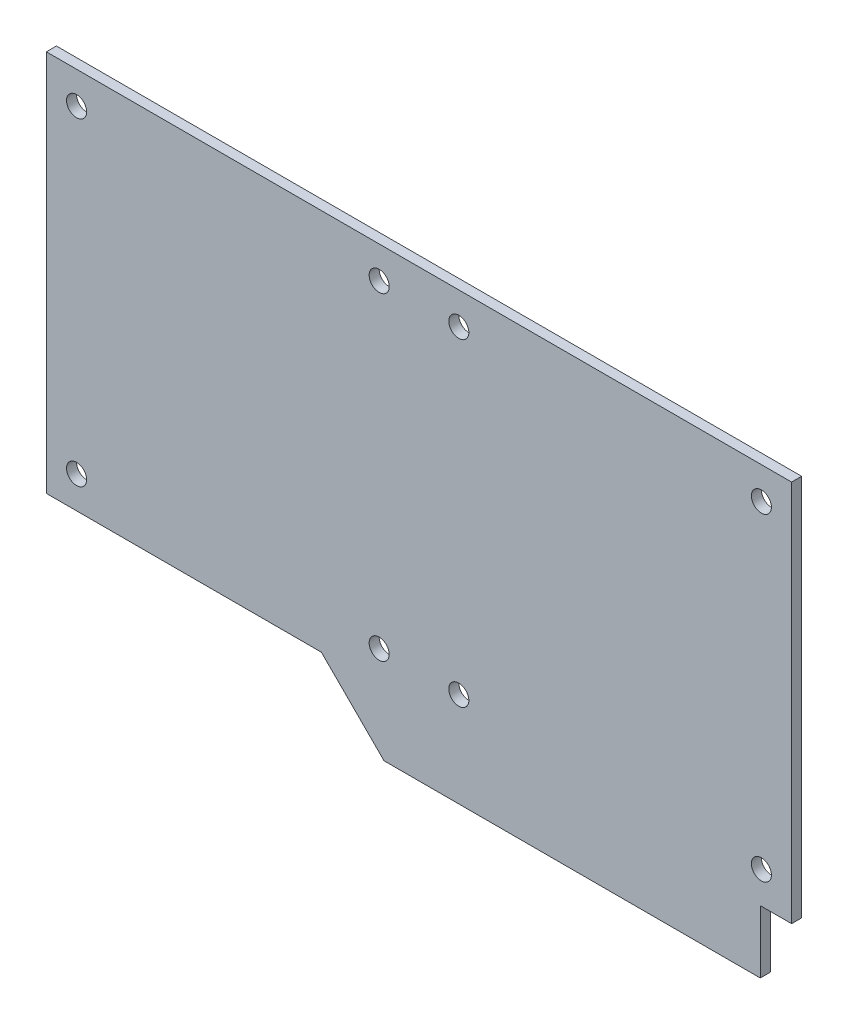
ISO-10303-21;
HEADER;
FILE_DESCRIPTION(('STEP AP214'),'2;1');
FILE_NAME('part.step','',(''),(''),'','','');
FILE_SCHEMA(('AUTOMOTIVE_DESIGN { 1 0 10303 214 1 1 1 1 }'));
ENDSEC;
DATA;
#1=APPLICATION_CONTEXT('core data for automotive mechanical design processes');
#2=APPLICATION_PROTOCOL_DEFINITION('international standard','automotive_design',2000,#1);
#3=PRODUCT_CONTEXT('',#1,'mechanical');
#4=PRODUCT('Part','Part','',(#3));
#5=PRODUCT_RELATED_PRODUCT_CATEGORY('part','',(#4));
#6=PRODUCT_DEFINITION_FORMATION('','',#4);
#7=PRODUCT_DEFINITION_CONTEXT('part definition',#1,'design');
#8=PRODUCT_DEFINITION('design','',#6,#7);
#9=PRODUCT_DEFINITION_SHAPE('','',#8);
#10=(LENGTH_UNIT() NAMED_UNIT(*) SI_UNIT(.MILLI.,.METRE.));
#11=(NAMED_UNIT(*) PLANE_ANGLE_UNIT() SI_UNIT($,.RADIAN.));
#12=(NAMED_UNIT(*) SI_UNIT($,.STERADIAN.) SOLID_ANGLE_UNIT());
#13=UNCERTAINTY_MEASURE_WITH_UNIT(LENGTH_MEASURE(1.E-05),#10,'distance_accuracy_value','');
#14=(GEOMETRIC_REPRESENTATION_CONTEXT(3) GLOBAL_UNCERTAINTY_ASSIGNED_CONTEXT((#13)) GLOBAL_UNIT_ASSIGNED_CONTEXT((#10,
#11,#12)) REPRESENTATION_CONTEXT('',''));
#15=CARTESIAN_POINT('',(0.,0.,0.));
#16=DIRECTION('',(0.,0.,1.));
#17=DIRECTION('',(1.,0.,0.));
#18=AXIS2_PLACEMENT_3D('',#15,#16,#17);
#19=CARTESIAN_POINT('',(59.43,30.5,0.));
#20=DIRECTION('',(0.,0.,1.));
#21=DIRECTION('',(1.,0.,0.));
#22=AXIS2_PLACEMENT_3D('',#19,#20,#21);
#23=PLANE('',#22);
#24=CARTESIAN_POINT('',(4.82,5.1,0.));
#25=DIRECTION('',(0.,0.,1.));
#26=DIRECTION('',(1.,0.,0.));
#27=AXIS2_PLACEMENT_3D('',#24,#25,#26);
#28=CIRCLE('',#27,1.6);
#29=CARTESIAN_POINT('',(6.42,5.1,0.));
#30=VERTEX_POINT('',#29);
#31=EDGE_CURVE('E138',#30,#30,#28,.T.);
#32=ORIENTED_EDGE('',*,*,#31,.T.);
#33=EDGE_LOOP('',(#32));
#34=FACE_BOUND('',#33,.T.);
#35=CARTESIAN_POINT('',(4.81999999999999,55.9,0.));
#36=DIRECTION('',(0.,0.,1.));
#37=DIRECTION('',(1.,0.,0.));
#38=AXIS2_PLACEMENT_3D('',#35,#36,#37);
#39=CIRCLE('',#38,1.6);
#40=CARTESIAN_POINT('',(6.41999999999999,55.9,0.));
#41=VERTEX_POINT('',#40);
#42=EDGE_CURVE('E142',#41,#41,#39,.T.);
#43=ORIENTED_EDGE('',*,*,#42,.T.);
#44=EDGE_LOOP('',(#43));
#45=FACE_BOUND('',#44,.T.);
#46=CARTESIAN_POINT('',(53.08,5.1,0.));
#47=DIRECTION('',(0.,0.,1.));
#48=DIRECTION('',(1.,0.,0.));
#49=AXIS2_PLACEMENT_3D('',#46,#47,#48);
#50=CIRCLE('',#49,1.6);
#51=CARTESIAN_POINT('',(54.68,5.1,0.));
#52=VERTEX_POINT('',#51);
#53=EDGE_CURVE('E146',#52,#52,#50,.T.);
#54=ORIENTED_EDGE('',*,*,#53,.T.);
#55=EDGE_LOOP('',(#54));
#56=FACE_BOUND('',#55,.T.);
#57=CARTESIAN_POINT('',(53.08,55.9,0.));
#58=DIRECTION('',(0.,0.,1.));
#59=DIRECTION('',(1.,0.,0.));
#60=AXIS2_PLACEMENT_3D('',#57,#58,#59);
#61=CIRCLE('',#60,1.6);
#62=CARTESIAN_POINT('',(54.68,55.9,0.));
#63=VERTEX_POINT('',#62);
#64=EDGE_CURVE('E149',#63,#63,#61,.T.);
#65=ORIENTED_EDGE('',*,*,#64,.T.);
#66=EDGE_LOOP('',(#65));
#67=FACE_BOUND('',#66,.T.);
#68=CARTESIAN_POINT('',(114.04,5.1,0.));
#69=DIRECTION('',(0.,0.,1.));
#70=DIRECTION('',(1.,0.,0.));
#71=AXIS2_PLACEMENT_3D('',#68,#69,#70);
#72=CIRCLE('',#71,1.6);
#73=CARTESIAN_POINT('',(115.64,5.1,0.));
#74=VERTEX_POINT('',#73);
#75=EDGE_CURVE('E152',#74,#74,#72,.T.);
#76=ORIENTED_EDGE('',*,*,#75,.T.);
#77=EDGE_LOOP('',(#76));
#78=FACE_BOUND('',#77,.T.);
#79=CARTESIAN_POINT('',(65.78,5.1,0.));
#80=DIRECTION('',(0.,0.,1.));
#81=DIRECTION('',(1.,0.,0.));
#82=AXIS2_PLACEMENT_3D('',#79,#80,#81);
#83=CIRCLE('',#82,1.6);
#84=CARTESIAN_POINT('',(67.38,5.1,0.));
#85=VERTEX_POINT('',#84);
#86=EDGE_CURVE('E155',#85,#85,#83,.T.);
#87=ORIENTED_EDGE('',*,*,#86,.T.);
#88=EDGE_LOOP('',(#87));
#89=FACE_BOUND('',#88,.T.);
#90=CARTESIAN_POINT('',(114.04,55.9,0.));
#91=DIRECTION('',(0.,0.,1.));
#92=DIRECTION('',(1.,0.,0.));
#93=AXIS2_PLACEMENT_3D('',#90,#91,#92);
#94=CIRCLE('',#93,1.6);
#95=CARTESIAN_POINT('',(115.64,55.9,0.));
#96=VERTEX_POINT('',#95);
#97=EDGE_CURVE('E157',#96,#96,#94,.T.);
#98=ORIENTED_EDGE('',*,*,#97,.T.);
#99=EDGE_LOOP('',(#98));
#100=FACE_BOUND('',#99,.T.);
#101=CARTESIAN_POINT('',(65.78,55.9,0.));
#102=DIRECTION('',(0.,0.,1.));
#103=DIRECTION('',(1.,0.,0.));
#104=AXIS2_PLACEMENT_3D('',#101,#102,#103);
#105=CIRCLE('',#104,1.6);
#106=CARTESIAN_POINT('',(67.38,55.9,0.));
#107=VERTEX_POINT('',#106);
#108=EDGE_CURVE('E20',#107,#107,#105,.T.);
#109=ORIENTED_EDGE('',*,*,#108,.T.);
#110=EDGE_LOOP('',(#109));
#111=FACE_BOUND('',#110,.T.);
#112=DIRECTION('',(0.,1.,0.));
#113=VECTOR('',#112,1.);
#114=CARTESIAN_POINT('',(0.,0.,0.));
#115=LINE('',#114,#113);
#116=CARTESIAN_POINT('',(0.,61.,0.));
#117=VERTEX_POINT('',#116);
#118=CARTESIAN_POINT('',(0.,0.,0.));
#119=VERTEX_POINT('',#118);
#120=EDGE_CURVE('E90',#117,#119,#115,.F.);
#121=ORIENTED_EDGE('',*,*,#120,.F.);
#122=DIRECTION('',(1.,0.,0.));
#123=VECTOR('',#122,1.);
#124=CARTESIAN_POINT('',(0.,61.,0.));
#125=LINE('',#124,#123);
#126=CARTESIAN_POINT('',(118.86,61.,0.));
#127=VERTEX_POINT('',#126);
#128=EDGE_CURVE('E165',#127,#117,#125,.F.);
#129=ORIENTED_EDGE('',*,*,#128,.F.);
#130=DIRECTION('',(0.,1.,0.));
#131=VECTOR('',#130,1.);
#132=CARTESIAN_POINT('',(118.86,61.,0.));
#133=LINE('',#132,#131);
#134=CARTESIAN_POINT('',(118.86,0.,0.));
#135=VERTEX_POINT('',#134);
#136=EDGE_CURVE('E176',#135,#127,#133,.T.);
#137=ORIENTED_EDGE('',*,*,#136,.F.);
#138=DIRECTION('',(1.,0.,0.));
#139=VECTOR('',#138,1.);
#140=CARTESIAN_POINT('',(118.86,0.,0.));
#141=LINE('',#140,#139);
#142=CARTESIAN_POINT('',(113.86,0.,0.));
#143=VERTEX_POINT('',#142);
#144=EDGE_CURVE('E181',#143,#135,#141,.T.);
#145=ORIENTED_EDGE('',*,*,#144,.F.);
#146=DIRECTION('',(0.,1.,0.));
#147=VECTOR('',#146,1.);
#148=CARTESIAN_POINT('',(113.86,-9.99999999999999,0.));
#149=LINE('',#148,#147);
#150=CARTESIAN_POINT('',(113.86,-9.99999999999999,0.));
#151=VERTEX_POINT('',#150);
#152=EDGE_CURVE('E189',#151,#143,#149,.T.);
#153=ORIENTED_EDGE('',*,*,#152,.F.);
#154=DIRECTION('',(1.,0.,0.));
#155=VECTOR('',#154,1.);
#156=CARTESIAN_POINT('',(53.86,-9.99999999999999,0.));
#157=LINE('',#156,#155);
#158=CARTESIAN_POINT('',(53.86,-9.99999999999999,0.));
#159=VERTEX_POINT('',#158);
#160=EDGE_CURVE('E194',#159,#151,#157,.T.);
#161=ORIENTED_EDGE('',*,*,#160,.F.);
#162=DIRECTION('',(0.707106781186548,-0.707106781186548,0.));
#163=VECTOR('',#162,1.);
#164=CARTESIAN_POINT('',(43.86,0.,0.));
#165=LINE('',#164,#163);
#166=CARTESIAN_POINT('',(43.86,0.,0.));
#167=VERTEX_POINT('',#166);
#168=EDGE_CURVE('E83',#167,#159,#165,.T.);
#169=ORIENTED_EDGE('',*,*,#168,.F.);
#170=DIRECTION('',(1.,0.,0.));
#171=VECTOR('',#170,1.);
#172=CARTESIAN_POINT('',(118.86,0.,0.));
#173=LINE('',#172,#171);
#174=EDGE_CURVE('E101',#119,#167,#173,.T.);
#175=ORIENTED_EDGE('',*,*,#174,.F.);
#176=EDGE_LOOP('',(#121,#129,#137,#145,#153,#161,#169,#175));
#177=FACE_BOUND('',#176,.T.);
#178=ADVANCED_FACE('F17',(#34,#45,#56,#67,#78,#89,#100,#111,#177),#23,.F.);
#179=CARTESIAN_POINT('',(0.,0.,0.));
#180=DIRECTION('',(-1.,0.,0.));
#181=DIRECTION('',(0.,0.,1.));
#182=AXIS2_PLACEMENT_3D('',#179,#180,#181);
#183=PLANE('',#182);
#184=ORIENTED_EDGE('',*,*,#120,.T.);
#185=DIRECTION('',(0.,0.,-1.));
#186=VECTOR('',#185,1.);
#187=CARTESIAN_POINT('',(0.,0.,0.));
#188=LINE('',#187,#186);
#189=CARTESIAN_POINT('',(0.,0.,1.6));
#190=VERTEX_POINT('',#189);
#191=EDGE_CURVE('E93',#190,#119,#188,.T.);
#192=ORIENTED_EDGE('',*,*,#191,.F.);
#193=DIRECTION('',(0.,1.,0.));
#194=VECTOR('',#193,1.);
#195=CARTESIAN_POINT('',(0.,30.5,1.6));
#196=LINE('',#195,#194);
#197=CARTESIAN_POINT('',(0.,61.,1.6));
#198=VERTEX_POINT('',#197);
#199=EDGE_CURVE('E141',#198,#190,#196,.F.);
#200=ORIENTED_EDGE('',*,*,#199,.F.);
#201=DIRECTION('',(0.,0.,1.));
#202=VECTOR('',#201,1.);
#203=CARTESIAN_POINT('',(0.,61.,0.));
#204=LINE('',#203,#202);
#205=EDGE_CURVE('E96',#117,#198,#204,.T.);
#206=ORIENTED_EDGE('',*,*,#205,.F.);
#207=EDGE_LOOP('',(#184,#192,#200,#206));
#208=FACE_BOUND('',#207,.T.);
#209=ADVANCED_FACE('F91',(#208),#183,.T.);
#210=CARTESIAN_POINT('',(118.86,0.,0.));
#211=DIRECTION('',(0.,-1.,0.));
#212=DIRECTION('',(0.,0.,-1.));
#213=AXIS2_PLACEMENT_3D('',#210,#211,#212);
#214=PLANE('',#213);
#215=ORIENTED_EDGE('',*,*,#191,.T.);
#216=ORIENTED_EDGE('',*,*,#174,.T.);
#217=DIRECTION('',(0.,0.,1.));
#218=VECTOR('',#217,1.);
#219=CARTESIAN_POINT('',(43.86,0.,1.6));
#220=LINE('',#219,#218);
#221=CARTESIAN_POINT('',(43.86,0.,1.6));
#222=VERTEX_POINT('',#221);
#223=EDGE_CURVE('E197',#222,#167,#220,.F.);
#224=ORIENTED_EDGE('',*,*,#223,.F.);
#225=DIRECTION('',(1.,0.,0.));
#226=VECTOR('',#225,1.);
#227=CARTESIAN_POINT('',(59.43,0.,1.6));
#228=LINE('',#227,#226);
#229=EDGE_CURVE('E108',#190,#222,#228,.T.);
#230=ORIENTED_EDGE('',*,*,#229,.F.);
#231=EDGE_LOOP('',(#215,#216,#224,#230));
#232=FACE_BOUND('',#231,.T.);
#233=ADVANCED_FACE('F106',(#232),#214,.T.);
#234=CARTESIAN_POINT('',(43.86,0.,1.6));
#235=DIRECTION('',(-0.707106781186548,-0.707106781186548,0.));
#236=DIRECTION('',(0.707106781186548,-0.707106781186548,0.));
#237=AXIS2_PLACEMENT_3D('',#234,#235,#236);
#238=PLANE('',#237);
#239=DIRECTION('',(0.707106781186547,-0.707106781186548,0.));
#240=VECTOR('',#239,1.);
#241=CARTESIAN_POINT('',(43.86,0.,1.6));
#242=LINE('',#241,#240);
#243=CARTESIAN_POINT('',(53.86,-9.99999999999999,1.6));
#244=VERTEX_POINT('',#243);
#245=EDGE_CURVE('E211',#222,#244,#242,.T.);
#246=ORIENTED_EDGE('',*,*,#245,.F.);
#247=ORIENTED_EDGE('',*,*,#223,.T.);
#248=ORIENTED_EDGE('',*,*,#168,.T.);
#249=DIRECTION('',(0.,0.,-1.));
#250=VECTOR('',#249,1.);
#251=CARTESIAN_POINT('',(53.86,-9.99999999999999,1.6));
#252=LINE('',#251,#250);
#253=EDGE_CURVE('E191',#244,#159,#252,.T.);
#254=ORIENTED_EDGE('',*,*,#253,.F.);
#255=EDGE_LOOP('',(#246,#247,#248,#254));
#256=FACE_BOUND('',#255,.T.);
#257=ADVANCED_FACE('F200',(#256),#238,.T.);
#258=CARTESIAN_POINT('',(53.86,-9.99999999999999,1.6));
#259=DIRECTION('',(0.,-1.,0.));
#260=DIRECTION('',(0.,0.,-1.));
#261=AXIS2_PLACEMENT_3D('',#258,#259,#260);
#262=PLANE('',#261);
#263=DIRECTION('',(1.,0.,0.));
#264=VECTOR('',#263,1.);
#265=CARTESIAN_POINT('',(59.43,-9.99999999999999,1.6));
#266=LINE('',#265,#264);
#267=CARTESIAN_POINT('',(113.86,-9.99999999999999,1.6));
#268=VERTEX_POINT('',#267);
#269=EDGE_CURVE('E205',#244,#268,#266,.T.);
#270=ORIENTED_EDGE('',*,*,#269,.F.);
#271=ORIENTED_EDGE('',*,*,#253,.T.);
#272=ORIENTED_EDGE('',*,*,#160,.T.);
#273=DIRECTION('',(0.,0.,-1.));
#274=VECTOR('',#273,1.);
#275=CARTESIAN_POINT('',(113.86,-9.99999999999999,1.6));
#276=LINE('',#275,#274);
#277=EDGE_CURVE('E186',#268,#151,#276,.T.);
#278=ORIENTED_EDGE('',*,*,#277,.F.);
#279=EDGE_LOOP('',(#270,#271,#272,#278));
#280=FACE_BOUND('',#279,.T.);
#281=ADVANCED_FACE('F203',(#280),#262,.T.);
#282=CARTESIAN_POINT('',(113.86,-9.99999999999999,1.6));
#283=DIRECTION('',(1.,0.,0.));
#284=DIRECTION('',(0.,0.,-1.));
#285=AXIS2_PLACEMENT_3D('',#282,#283,#284);
#286=PLANE('',#285);
#287=DIRECTION('',(0.,1.,0.));
#288=VECTOR('',#287,1.);
#289=CARTESIAN_POINT('',(113.86,30.5,1.6));
#290=LINE('',#289,#288);
#291=CARTESIAN_POINT('',(113.86,0.,1.6));
#292=VERTEX_POINT('',#291);
#293=EDGE_CURVE('E210',#268,#292,#290,.T.);
#294=ORIENTED_EDGE('',*,*,#293,.F.);
#295=ORIENTED_EDGE('',*,*,#277,.T.);
#296=ORIENTED_EDGE('',*,*,#152,.T.);
#297=DIRECTION('',(0.,0.,-1.));
#298=VECTOR('',#297,1.);
#299=CARTESIAN_POINT('',(113.86,0.,0.));
#300=LINE('',#299,#298);
#301=EDGE_CURVE('E183',#292,#143,#300,.T.);
#302=ORIENTED_EDGE('',*,*,#301,.F.);
#303=EDGE_LOOP('',(#294,#295,#296,#302));
#304=FACE_BOUND('',#303,.T.);
#305=ADVANCED_FACE('F232',(#304),#286,.T.);
#306=CARTESIAN_POINT('',(118.86,0.,0.));
#307=DIRECTION('',(0.,-1.,0.));
#308=DIRECTION('',(0.,0.,-1.));
#309=AXIS2_PLACEMENT_3D('',#306,#307,#308);
#310=PLANE('',#309);
#311=DIRECTION('',(0.,0.,-1.));
#312=VECTOR('',#311,1.);
#313=CARTESIAN_POINT('',(118.86,0.,0.));
#314=LINE('',#313,#312);
#315=CARTESIAN_POINT('',(118.86,0.,1.6));
#316=VERTEX_POINT('',#315);
#317=EDGE_CURVE('E178',#316,#135,#314,.T.);
#318=ORIENTED_EDGE('',*,*,#317,.F.);
#319=DIRECTION('',(1.,0.,0.));
#320=VECTOR('',#319,1.);
#321=CARTESIAN_POINT('',(59.43,0.,1.6));
#322=LINE('',#321,#320);
#323=EDGE_CURVE('E219',#292,#316,#322,.T.);
#324=ORIENTED_EDGE('',*,*,#323,.F.);
#325=ORIENTED_EDGE('',*,*,#301,.T.);
#326=ORIENTED_EDGE('',*,*,#144,.T.);
#327=EDGE_LOOP('',(#318,#324,#325,#326));
#328=FACE_BOUND('',#327,.T.);
#329=ADVANCED_FACE('F230',(#328),#310,.T.);
#330=CARTESIAN_POINT('',(118.86,61.,0.));
#331=DIRECTION('',(1.,0.,0.));
#332=DIRECTION('',(0.,0.,-1.));
#333=AXIS2_PLACEMENT_3D('',#330,#331,#332);
#334=PLANE('',#333);
#335=ORIENTED_EDGE('',*,*,#136,.T.);
#336=DIRECTION('',(0.,0.,1.));
#337=VECTOR('',#336,1.);
#338=CARTESIAN_POINT('',(118.86,61.,0.));
#339=LINE('',#338,#337);
#340=CARTESIAN_POINT('',(118.86,61.,1.6));
#341=VERTEX_POINT('',#340);
#342=EDGE_CURVE('E36',#341,#127,#339,.F.);
#343=ORIENTED_EDGE('',*,*,#342,.F.);
#344=DIRECTION('',(0.,1.,0.));
#345=VECTOR('',#344,1.);
#346=CARTESIAN_POINT('',(118.86,30.5,1.6));
#347=LINE('',#346,#345);
#348=EDGE_CURVE('E222',#316,#341,#347,.T.);
#349=ORIENTED_EDGE('',*,*,#348,.F.);
#350=ORIENTED_EDGE('',*,*,#317,.T.);
#351=EDGE_LOOP('',(#335,#343,#349,#350));
#352=FACE_BOUND('',#351,.T.);
#353=ADVANCED_FACE('F227',(#352),#334,.T.);
#354=CARTESIAN_POINT('',(0.,61.,0.));
#355=DIRECTION('',(0.,1.,0.));
#356=DIRECTION('',(0.,0.,1.));
#357=AXIS2_PLACEMENT_3D('',#354,#355,#356);
#358=PLANE('',#357);
#359=ORIENTED_EDGE('',*,*,#128,.T.);
#360=ORIENTED_EDGE('',*,*,#205,.T.);
#361=DIRECTION('',(1.,0.,0.));
#362=VECTOR('',#361,1.);
#363=CARTESIAN_POINT('',(59.43,61.,1.6));
#364=LINE('',#363,#362);
#365=EDGE_CURVE('E137',#341,#198,#364,.F.);
#366=ORIENTED_EDGE('',*,*,#365,.F.);
#367=ORIENTED_EDGE('',*,*,#342,.T.);
#368=EDGE_LOOP('',(#359,#360,#366,#367));
#369=FACE_BOUND('',#368,.T.);
#370=ADVANCED_FACE('F224',(#369),#358,.T.);
#371=CARTESIAN_POINT('',(65.78,55.9,-132.008606010242));
#372=DIRECTION('',(0.,0.,1.));
#373=DIRECTION('',(1.,0.,0.));
#374=AXIS2_PLACEMENT_3D('',#371,#372,#373);
#375=CYLINDRICAL_SURFACE('',#374,1.6);
#376=CARTESIAN_POINT('',(65.78,55.9,1.59999999999999));
#377=DIRECTION('',(0.,0.,1.));
#378=DIRECTION('',(1.,0.,0.));
#379=AXIS2_PLACEMENT_3D('',#376,#377,#378);
#380=CIRCLE('',#379,1.6);
#381=CARTESIAN_POINT('',(67.38,55.9,1.59999999999999));
#382=VERTEX_POINT('',#381);
#383=EDGE_CURVE('E134',#382,#382,#380,.F.);
#384=ORIENTED_EDGE('',*,*,#383,.F.);
#385=EDGE_LOOP('',(#384));
#386=FACE_BOUND('',#385,.T.);
#387=ORIENTED_EDGE('',*,*,#108,.F.);
#388=EDGE_LOOP('',(#387));
#389=FACE_BOUND('',#388,.T.);
#390=ADVANCED_FACE('F276',(#386,#389),#375,.F.);
#391=CARTESIAN_POINT('',(114.04,55.9,-132.008606010242));
#392=DIRECTION('',(0.,0.,1.));
#393=DIRECTION('',(1.,0.,0.));
#394=AXIS2_PLACEMENT_3D('',#391,#392,#393);
#395=CYLINDRICAL_SURFACE('',#394,1.6);
#396=CARTESIAN_POINT('',(114.04,55.9,1.59999999999999));
#397=DIRECTION('',(0.,0.,1.));
#398=DIRECTION('',(1.,0.,0.));
#399=AXIS2_PLACEMENT_3D('',#396,#397,#398);
#400=CIRCLE('',#399,1.6);
#401=CARTESIAN_POINT('',(115.64,55.9,1.59999999999999));
#402=VERTEX_POINT('',#401);
#403=EDGE_CURVE('E131',#402,#402,#400,.F.);
#404=ORIENTED_EDGE('',*,*,#403,.F.);
#405=EDGE_LOOP('',(#404));
#406=FACE_BOUND('',#405,.T.);
#407=ORIENTED_EDGE('',*,*,#97,.F.);
#408=EDGE_LOOP('',(#407));
#409=FACE_BOUND('',#408,.T.);
#410=ADVANCED_FACE('F272',(#406,#409),#395,.F.);
#411=CARTESIAN_POINT('',(65.78,5.1,-132.008606010242));
#412=DIRECTION('',(0.,0.,1.));
#413=DIRECTION('',(1.,0.,0.));
#414=AXIS2_PLACEMENT_3D('',#411,#412,#413);
#415=CYLINDRICAL_SURFACE('',#414,1.6);
#416=CARTESIAN_POINT('',(65.78,5.1,1.59999999999999));
#417=DIRECTION('',(0.,0.,1.));
#418=DIRECTION('',(1.,0.,0.));
#419=AXIS2_PLACEMENT_3D('',#416,#417,#418);
#420=CIRCLE('',#419,1.6);
#421=CARTESIAN_POINT('',(67.38,5.1,1.59999999999999));
#422=VERTEX_POINT('',#421);
#423=EDGE_CURVE('E128',#422,#422,#420,.F.);
#424=ORIENTED_EDGE('',*,*,#423,.F.);
#425=EDGE_LOOP('',(#424));
#426=FACE_BOUND('',#425,.T.);
#427=ORIENTED_EDGE('',*,*,#86,.F.);
#428=EDGE_LOOP('',(#427));
#429=FACE_BOUND('',#428,.T.);
#430=ADVANCED_FACE('F268',(#426,#429),#415,.F.);
#431=CARTESIAN_POINT('',(114.04,5.1,-132.008606010242));
#432=DIRECTION('',(0.,0.,1.));
#433=DIRECTION('',(1.,0.,0.));
#434=AXIS2_PLACEMENT_3D('',#431,#432,#433);
#435=CYLINDRICAL_SURFACE('',#434,1.6);
#436=CARTESIAN_POINT('',(114.04,5.1,1.59999999999999));
#437=DIRECTION('',(0.,0.,1.));
#438=DIRECTION('',(1.,0.,0.));
#439=AXIS2_PLACEMENT_3D('',#436,#437,#438);
#440=CIRCLE('',#439,1.6);
#441=CARTESIAN_POINT('',(115.64,5.1,1.59999999999999));
#442=VERTEX_POINT('',#441);
#443=EDGE_CURVE('E125',#442,#442,#440,.F.);
#444=ORIENTED_EDGE('',*,*,#443,.F.);
#445=EDGE_LOOP('',(#444));
#446=FACE_BOUND('',#445,.T.);
#447=ORIENTED_EDGE('',*,*,#75,.F.);
#448=EDGE_LOOP('',(#447));
#449=FACE_BOUND('',#448,.T.);
#450=ADVANCED_FACE('F264',(#446,#449),#435,.F.);
#451=CARTESIAN_POINT('',(53.08,55.9,-132.008606010242));
#452=DIRECTION('',(0.,0.,1.));
#453=DIRECTION('',(1.,0.,0.));
#454=AXIS2_PLACEMENT_3D('',#451,#452,#453);
#455=CYLINDRICAL_SURFACE('',#454,1.6);
#456=CARTESIAN_POINT('',(53.08,55.9,1.59999999999999));
#457=DIRECTION('',(0.,0.,1.));
#458=DIRECTION('',(1.,0.,0.));
#459=AXIS2_PLACEMENT_3D('',#456,#457,#458);
#460=CIRCLE('',#459,1.6);
#461=CARTESIAN_POINT('',(54.68,55.9,1.59999999999999));
#462=VERTEX_POINT('',#461);
#463=EDGE_CURVE('E122',#462,#462,#460,.F.);
#464=ORIENTED_EDGE('',*,*,#463,.F.);
#465=EDGE_LOOP('',(#464));
#466=FACE_BOUND('',#465,.T.);
#467=ORIENTED_EDGE('',*,*,#64,.F.);
#468=EDGE_LOOP('',(#467));
#469=FACE_BOUND('',#468,.T.);
#470=ADVANCED_FACE('F260',(#466,#469),#455,.F.);
#471=CARTESIAN_POINT('',(53.08,5.1,-132.008606010242));
#472=DIRECTION('',(0.,0.,1.));
#473=DIRECTION('',(1.,0.,0.));
#474=AXIS2_PLACEMENT_3D('',#471,#472,#473);
#475=CYLINDRICAL_SURFACE('',#474,1.6);
#476=CARTESIAN_POINT('',(53.08,5.1,1.59999999999999));
#477=DIRECTION('',(0.,0.,1.));
#478=DIRECTION('',(1.,0.,0.));
#479=AXIS2_PLACEMENT_3D('',#476,#477,#478);
#480=CIRCLE('',#479,1.6);
#481=CARTESIAN_POINT('',(54.68,5.1,1.59999999999999));
#482=VERTEX_POINT('',#481);
#483=EDGE_CURVE('E119',#482,#482,#480,.F.);
#484=ORIENTED_EDGE('',*,*,#483,.F.);
#485=EDGE_LOOP('',(#484));
#486=FACE_BOUND('',#485,.T.);
#487=ORIENTED_EDGE('',*,*,#53,.F.);
#488=EDGE_LOOP('',(#487));
#489=FACE_BOUND('',#488,.T.);
#490=ADVANCED_FACE('F256',(#486,#489),#475,.F.);
#491=CARTESIAN_POINT('',(4.81999999999999,55.9,-132.008606010242));
#492=DIRECTION('',(0.,0.,1.));
#493=DIRECTION('',(1.,0.,0.));
#494=AXIS2_PLACEMENT_3D('',#491,#492,#493);
#495=CYLINDRICAL_SURFACE('',#494,1.6);
#496=CARTESIAN_POINT('',(4.81999999999999,55.9,1.59999999999999));
#497=DIRECTION('',(0.,0.,1.));
#498=DIRECTION('',(1.,0.,0.));
#499=AXIS2_PLACEMENT_3D('',#496,#497,#498);
#500=CIRCLE('',#499,1.6);
#501=CARTESIAN_POINT('',(6.41999999999999,55.9,1.59999999999999));
#502=VERTEX_POINT('',#501);
#503=EDGE_CURVE('E27',#502,#502,#500,.F.);
#504=ORIENTED_EDGE('',*,*,#503,.F.);
#505=EDGE_LOOP('',(#504));
#506=FACE_BOUND('',#505,.T.);
#507=ORIENTED_EDGE('',*,*,#42,.F.);
#508=EDGE_LOOP('',(#507));
#509=FACE_BOUND('',#508,.T.);
#510=ADVANCED_FACE('F249',(#506,#509),#495,.F.);
#511=CARTESIAN_POINT('',(4.82,5.1,-132.008606010242));
#512=DIRECTION('',(0.,0.,1.));
#513=DIRECTION('',(1.,0.,0.));
#514=AXIS2_PLACEMENT_3D('',#511,#512,#513);
#515=CYLINDRICAL_SURFACE('',#514,1.6);
#516=CARTESIAN_POINT('',(4.82,5.1,1.59999999999999));
#517=DIRECTION('',(0.,0.,1.));
#518=DIRECTION('',(1.,0.,0.));
#519=AXIS2_PLACEMENT_3D('',#516,#517,#518);
#520=CIRCLE('',#519,1.6);
#521=CARTESIAN_POINT('',(6.42,5.1,1.59999999999999));
#522=VERTEX_POINT('',#521);
#523=EDGE_CURVE('E11',#522,#522,#520,.F.);
#524=ORIENTED_EDGE('',*,*,#523,.F.);
#525=EDGE_LOOP('',(#524));
#526=FACE_BOUND('',#525,.T.);
#527=ORIENTED_EDGE('',*,*,#31,.F.);
#528=EDGE_LOOP('',(#527));
#529=FACE_BOUND('',#528,.T.);
#530=ADVANCED_FACE('F243',(#526,#529),#515,.F.);
#531=CARTESIAN_POINT('',(59.43,30.5,1.6));
#532=DIRECTION('',(0.,0.,1.));
#533=DIRECTION('',(1.,0.,0.));
#534=AXIS2_PLACEMENT_3D('',#531,#532,#533);
#535=PLANE('',#534);
#536=ORIENTED_EDGE('',*,*,#523,.T.);
#537=EDGE_LOOP('',(#536));
#538=FACE_BOUND('',#537,.T.);
#539=ORIENTED_EDGE('',*,*,#503,.T.);
#540=EDGE_LOOP('',(#539));
#541=FACE_BOUND('',#540,.T.);
#542=ORIENTED_EDGE('',*,*,#483,.T.);
#543=EDGE_LOOP('',(#542));
#544=FACE_BOUND('',#543,.T.);
#545=ORIENTED_EDGE('',*,*,#463,.T.);
#546=EDGE_LOOP('',(#545));
#547=FACE_BOUND('',#546,.T.);
#548=ORIENTED_EDGE('',*,*,#443,.T.);
#549=EDGE_LOOP('',(#548));
#550=FACE_BOUND('',#549,.T.);
#551=ORIENTED_EDGE('',*,*,#423,.T.);
#552=EDGE_LOOP('',(#551));
#553=FACE_BOUND('',#552,.T.);
#554=ORIENTED_EDGE('',*,*,#403,.T.);
#555=EDGE_LOOP('',(#554));
#556=FACE_BOUND('',#555,.T.);
#557=ORIENTED_EDGE('',*,*,#383,.T.);
#558=EDGE_LOOP('',(#557));
#559=FACE_BOUND('',#558,.T.);
#560=ORIENTED_EDGE('',*,*,#348,.T.);
#561=ORIENTED_EDGE('',*,*,#365,.T.);
#562=ORIENTED_EDGE('',*,*,#199,.T.);
#563=ORIENTED_EDGE('',*,*,#229,.T.);
#564=ORIENTED_EDGE('',*,*,#245,.T.);
#565=ORIENTED_EDGE('',*,*,#269,.T.);
#566=ORIENTED_EDGE('',*,*,#293,.T.);
#567=ORIENTED_EDGE('',*,*,#323,.T.);
#568=EDGE_LOOP('',(#560,#561,#562,#563,#564,#565,#566,#567));
#569=FACE_BOUND('',#568,.T.);
#570=ADVANCED_FACE('F214',(#538,#541,#544,#547,#550,#553,#556,#559,#569),#535,.T.);
#571=CLOSED_SHELL('',(#178,#209,#233,#257,#281,#305,#329,#353,#370,#390,#410,#430,#450,#470,
#490,#510,#530,#570));
#572=MANIFOLD_SOLID_BREP('B1',#571);
#573=ADVANCED_BREP_SHAPE_REPRESENTATION('',(#18,#572),#14);
#574=SHAPE_DEFINITION_REPRESENTATION(#9,#573);
ENDSEC;
END-ISO-10303-21;
